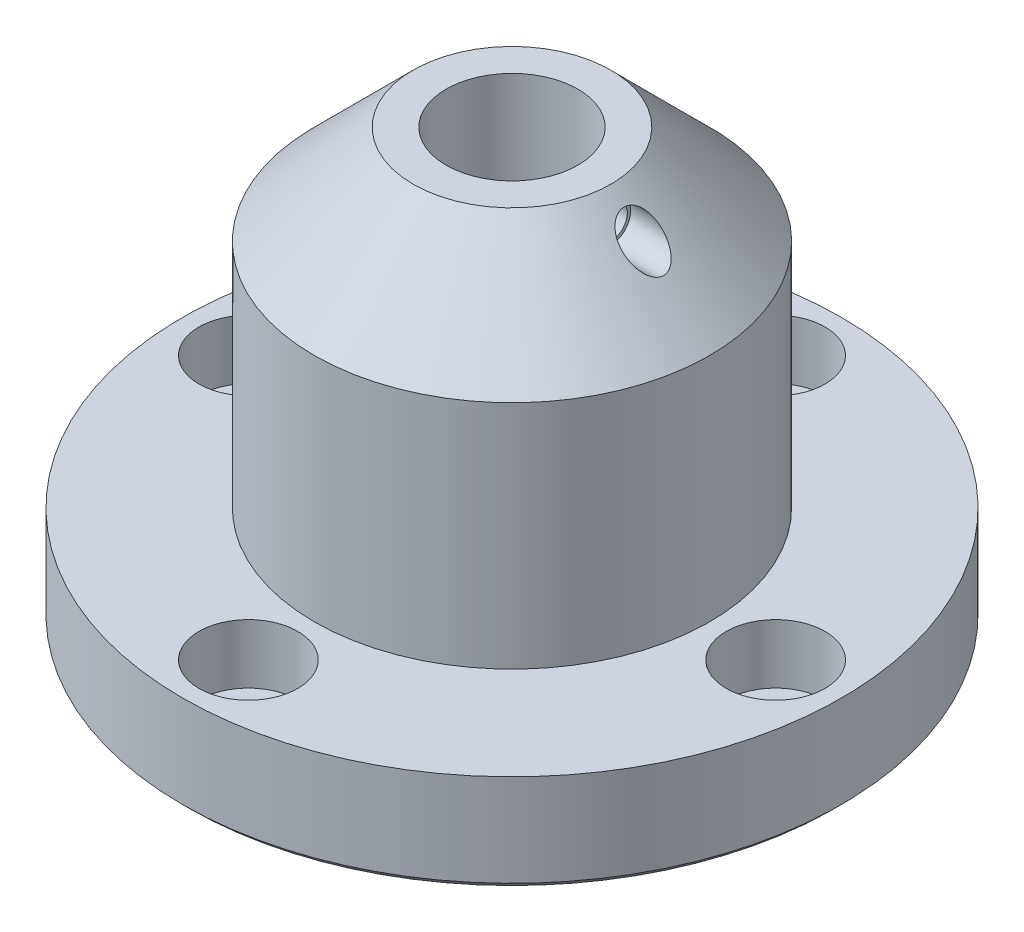
ISO-10303-21;
HEADER;
FILE_DESCRIPTION(('STEP AP214'),'2;1');
FILE_NAME('part.step','',(''),(''),'','','');
FILE_SCHEMA(('AUTOMOTIVE_DESIGN { 1 0 10303 214 1 1 1 1 }'));
ENDSEC;
DATA;
#1=APPLICATION_CONTEXT('core data for automotive mechanical design processes');
#2=APPLICATION_PROTOCOL_DEFINITION('international standard','automotive_design',2000,#1);
#3=PRODUCT_CONTEXT('',#1,'mechanical');
#4=PRODUCT('Part','Part','',(#3));
#5=PRODUCT_RELATED_PRODUCT_CATEGORY('part','',(#4));
#6=PRODUCT_DEFINITION_FORMATION('','',#4);
#7=PRODUCT_DEFINITION_CONTEXT('part definition',#1,'design');
#8=PRODUCT_DEFINITION('design','',#6,#7);
#9=PRODUCT_DEFINITION_SHAPE('','',#8);
#10=(LENGTH_UNIT() NAMED_UNIT(*) SI_UNIT(.MILLI.,.METRE.));
#11=(NAMED_UNIT(*) PLANE_ANGLE_UNIT() SI_UNIT($,.RADIAN.));
#12=(NAMED_UNIT(*) SI_UNIT($,.STERADIAN.) SOLID_ANGLE_UNIT());
#13=UNCERTAINTY_MEASURE_WITH_UNIT(LENGTH_MEASURE(1.E-05),#10,'distance_accuracy_value','');
#14=(GEOMETRIC_REPRESENTATION_CONTEXT(3) GLOBAL_UNCERTAINTY_ASSIGNED_CONTEXT((#13)) GLOBAL_UNIT_ASSIGNED_CONTEXT((#10,
#11,#12)) REPRESENTATION_CONTEXT('',''));
#15=CARTESIAN_POINT('',(0.,0.,0.));
#16=DIRECTION('',(0.,0.,1.));
#17=DIRECTION('',(1.,0.,0.));
#18=AXIS2_PLACEMENT_3D('',#15,#16,#17);
#19=CARTESIAN_POINT('',(0.,15.,0.));
#20=DIRECTION('',(0.,1.,0.));
#21=DIRECTION('',(0.,0.,1.));
#22=AXIS2_PLACEMENT_3D('',#19,#20,#21);
#23=PLANE('',#22);
#24=CARTESIAN_POINT('',(0.,15.,-40.));
#25=DIRECTION('',(0.,1.,0.));
#26=DIRECTION('',(0.,0.,1.));
#27=AXIS2_PLACEMENT_3D('',#24,#25,#26);
#28=CIRCLE('',#27,7.5);
#29=CARTESIAN_POINT('',(0.,15.,-32.5));
#30=VERTEX_POINT('',#29);
#31=EDGE_CURVE('E95',#30,#30,#28,.T.);
#32=ORIENTED_EDGE('',*,*,#31,.F.);
#33=EDGE_LOOP('',(#32));
#34=FACE_BOUND('',#33,.T.);
#35=CARTESIAN_POINT('',(0.,15.,40.));
#36=DIRECTION('',(0.,1.,0.));
#37=DIRECTION('',(0.,0.,1.));
#38=AXIS2_PLACEMENT_3D('',#35,#36,#37);
#39=CIRCLE('',#38,7.5);
#40=CARTESIAN_POINT('',(0.,15.,47.5));
#41=VERTEX_POINT('',#40);
#42=EDGE_CURVE('E83',#41,#41,#39,.T.);
#43=ORIENTED_EDGE('',*,*,#42,.F.);
#44=EDGE_LOOP('',(#43));
#45=FACE_BOUND('',#44,.T.);
#46=CARTESIAN_POINT('',(-40.,15.,0.));
#47=DIRECTION('',(0.,1.,0.));
#48=DIRECTION('',(0.,0.,1.));
#49=AXIS2_PLACEMENT_3D('',#46,#47,#48);
#50=CIRCLE('',#49,7.5);
#51=CARTESIAN_POINT('',(-40.,15.,7.5));
#52=VERTEX_POINT('',#51);
#53=EDGE_CURVE('E71',#52,#52,#50,.T.);
#54=ORIENTED_EDGE('',*,*,#53,.F.);
#55=EDGE_LOOP('',(#54));
#56=FACE_BOUND('',#55,.T.);
#57=CARTESIAN_POINT('',(40.,15.,0.));
#58=DIRECTION('',(0.,1.,0.));
#59=DIRECTION('',(0.,0.,1.));
#60=AXIS2_PLACEMENT_3D('',#57,#58,#59);
#61=CIRCLE('',#60,7.5);
#62=CARTESIAN_POINT('',(40.,15.,7.5));
#63=VERTEX_POINT('',#62);
#64=EDGE_CURVE('E59',#63,#63,#61,.T.);
#65=ORIENTED_EDGE('',*,*,#64,.F.);
#66=EDGE_LOOP('',(#65));
#67=FACE_BOUND('',#66,.T.);
#68=CARTESIAN_POINT('',(0.,15.,0.));
#69=DIRECTION('',(0.,1.,0.));
#70=DIRECTION('',(0.,0.,1.));
#71=AXIS2_PLACEMENT_3D('',#68,#69,#70);
#72=CIRCLE('',#71,50.);
#73=CARTESIAN_POINT('',(0.,15.,50.));
#74=VERTEX_POINT('',#73);
#75=EDGE_CURVE('E38',#74,#74,#72,.T.);
#76=ORIENTED_EDGE('',*,*,#75,.T.);
#77=EDGE_LOOP('',(#76));
#78=FACE_BOUND('',#77,.T.);
#79=CARTESIAN_POINT('',(0.,15.,0.));
#80=DIRECTION('',(0.,1.,0.));
#81=DIRECTION('',(0.,0.,1.));
#82=AXIS2_PLACEMENT_3D('',#79,#80,#81);
#83=CIRCLE('',#82,30.);
#84=CARTESIAN_POINT('',(0.,15.,30.));
#85=VERTEX_POINT('',#84);
#86=EDGE_CURVE('E41',#85,#85,#83,.T.);
#87=ORIENTED_EDGE('',*,*,#86,.F.);
#88=EDGE_LOOP('',(#87));
#89=FACE_BOUND('',#88,.T.);
#90=ADVANCED_FACE('F15',(#34,#45,#56,#67,#78,#89),#23,.T.);
#91=CARTESIAN_POINT('',(0.,15.,0.));
#92=DIRECTION('',(0.,-1.,0.));
#93=DIRECTION('',(0.,0.,-1.));
#94=AXIS2_PLACEMENT_3D('',#91,#92,#93);
#95=CYLINDRICAL_SURFACE('',#94,50.);
#96=CARTESIAN_POINT('',(0.,1.,0.));
#97=DIRECTION('',(0.,1.,0.));
#98=DIRECTION('',(0.,0.,1.));
#99=AXIS2_PLACEMENT_3D('',#96,#97,#98);
#100=CIRCLE('',#99,50.);
#101=CARTESIAN_POINT('',(0.,1.,50.));
#102=VERTEX_POINT('',#101);
#103=EDGE_CURVE('E26',#102,#102,#100,.T.);
#104=ORIENTED_EDGE('',*,*,#103,.T.);
#105=EDGE_LOOP('',(#104));
#106=FACE_BOUND('',#105,.T.);
#107=ORIENTED_EDGE('',*,*,#75,.F.);
#108=EDGE_LOOP('',(#107));
#109=FACE_BOUND('',#108,.T.);
#110=ADVANCED_FACE('F126',(#106,#109),#95,.T.);
#111=CARTESIAN_POINT('',(0.,0.,0.));
#112=DIRECTION('',(0.,1.,0.));
#113=DIRECTION('',(0.,0.,1.));
#114=AXIS2_PLACEMENT_3D('',#111,#112,#113);
#115=PLANE('',#114);
#116=CARTESIAN_POINT('',(0.,0.,-40.));
#117=DIRECTION('',(0.,1.,0.));
#118=DIRECTION('',(0.,0.,1.));
#119=AXIS2_PLACEMENT_3D('',#116,#117,#118);
#120=CIRCLE('',#119,4.5);
#121=CARTESIAN_POINT('',(0.,0.,-35.5));
#122=VERTEX_POINT('',#121);
#123=EDGE_CURVE('E86',#122,#122,#120,.T.);
#124=ORIENTED_EDGE('',*,*,#123,.T.);
#125=EDGE_LOOP('',(#124));
#126=FACE_BOUND('',#125,.T.);
#127=CARTESIAN_POINT('',(0.,0.,40.));
#128=DIRECTION('',(0.,1.,0.));
#129=DIRECTION('',(0.,0.,1.));
#130=AXIS2_PLACEMENT_3D('',#127,#128,#129);
#131=CIRCLE('',#130,4.5);
#132=CARTESIAN_POINT('',(0.,0.,44.5));
#133=VERTEX_POINT('',#132);
#134=EDGE_CURVE('E74',#133,#133,#131,.T.);
#135=ORIENTED_EDGE('',*,*,#134,.T.);
#136=EDGE_LOOP('',(#135));
#137=FACE_BOUND('',#136,.T.);
#138=CARTESIAN_POINT('',(-40.,0.,0.));
#139=DIRECTION('',(0.,1.,0.));
#140=DIRECTION('',(0.,0.,1.));
#141=AXIS2_PLACEMENT_3D('',#138,#139,#140);
#142=CIRCLE('',#141,4.5);
#143=CARTESIAN_POINT('',(-40.,0.,4.5));
#144=VERTEX_POINT('',#143);
#145=EDGE_CURVE('E62',#144,#144,#142,.T.);
#146=ORIENTED_EDGE('',*,*,#145,.T.);
#147=EDGE_LOOP('',(#146));
#148=FACE_BOUND('',#147,.T.);
#149=CARTESIAN_POINT('',(40.,0.,0.));
#150=DIRECTION('',(0.,1.,0.));
#151=DIRECTION('',(0.,0.,1.));
#152=AXIS2_PLACEMENT_3D('',#149,#150,#151);
#153=CIRCLE('',#152,4.5);
#154=CARTESIAN_POINT('',(40.,0.,4.5));
#155=VERTEX_POINT('',#154);
#156=EDGE_CURVE('E50',#155,#155,#153,.T.);
#157=ORIENTED_EDGE('',*,*,#156,.T.);
#158=EDGE_LOOP('',(#157));
#159=FACE_BOUND('',#158,.T.);
#160=CARTESIAN_POINT('',(0.,0.,0.));
#161=DIRECTION('',(0.,1.,0.));
#162=DIRECTION('',(0.,0.,1.));
#163=AXIS2_PLACEMENT_3D('',#160,#161,#162);
#164=CIRCLE('',#163,49.);
#165=CARTESIAN_POINT('',(0.,0.,49.));
#166=VERTEX_POINT('',#165);
#167=EDGE_CURVE('E10',#166,#166,#164,.F.);
#168=ORIENTED_EDGE('',*,*,#167,.T.);
#169=EDGE_LOOP('',(#168));
#170=FACE_BOUND('',#169,.T.);
#171=ADVANCED_FACE('F133',(#126,#137,#148,#159,#170),#115,.F.);
#172=CARTESIAN_POINT('',(0.,65.,0.));
#173=DIRECTION('',(0.,-1.,0.));
#174=DIRECTION('',(0.,0.,-1.));
#175=AXIS2_PLACEMENT_3D('',#172,#173,#174);
#176=CYLINDRICAL_SURFACE('',#175,30.);
#177=CARTESIAN_POINT('',(0.,50.,0.));
#178=DIRECTION('',(0.,1.,0.));
#179=DIRECTION('',(0.,0.,1.));
#180=AXIS2_PLACEMENT_3D('',#177,#178,#179);
#181=CIRCLE('',#180,30.);
#182=CARTESIAN_POINT('',(0.,50.,30.));
#183=VERTEX_POINT('',#182);
#184=EDGE_CURVE('E30',#183,#183,#181,.F.);
#185=ORIENTED_EDGE('',*,*,#184,.T.);
#186=EDGE_LOOP('',(#185));
#187=FACE_BOUND('',#186,.T.);
#188=ORIENTED_EDGE('',*,*,#86,.T.);
#189=EDGE_LOOP('',(#188));
#190=FACE_BOUND('',#189,.T.);
#191=ADVANCED_FACE('F140',(#187,#190),#176,.T.);
#192=CARTESIAN_POINT('',(0.,65.,0.));
#193=DIRECTION('',(0.,1.,0.));
#194=DIRECTION('',(0.,0.,1.));
#195=AXIS2_PLACEMENT_3D('',#192,#193,#194);
#196=PLANE('',#195);
#197=CARTESIAN_POINT('',(0.,65.,0.));
#198=DIRECTION('',(0.,1.,0.));
#199=DIRECTION('',(0.,0.,1.));
#200=AXIS2_PLACEMENT_3D('',#197,#198,#199);
#201=CIRCLE('',#200,10.);
#202=CARTESIAN_POINT('',(0.,65.,10.));
#203=VERTEX_POINT('',#202);
#204=EDGE_CURVE('E47',#203,#203,#201,.T.);
#205=ORIENTED_EDGE('',*,*,#204,.F.);
#206=EDGE_LOOP('',(#205));
#207=FACE_BOUND('',#206,.T.);
#208=CARTESIAN_POINT('',(0.,65.,0.));
#209=DIRECTION('',(0.,1.,0.));
#210=DIRECTION('',(0.,0.,1.));
#211=AXIS2_PLACEMENT_3D('',#208,#209,#210);
#212=CIRCLE('',#211,15.);
#213=CARTESIAN_POINT('',(0.,65.,15.));
#214=VERTEX_POINT('',#213);
#215=EDGE_CURVE('E35',#214,#214,#212,.T.);
#216=ORIENTED_EDGE('',*,*,#215,.T.);
#217=EDGE_LOOP('',(#216));
#218=FACE_BOUND('',#217,.T.);
#219=ADVANCED_FACE('F147',(#207,#218),#196,.T.);
#220=CARTESIAN_POINT('',(0.,65.,0.));
#221=DIRECTION('',(0.,-1.,0.));
#222=DIRECTION('',(0.,0.,-1.));
#223=AXIS2_PLACEMENT_3D('',#220,#221,#222);
#224=CONICAL_SURFACE('',#223,15.,0.785398163397446);
#225=CARTESIAN_POINT('',(17.9939348525649,61.8519422106139,-2.3601504292198));
#226=CARTESIAN_POINT('',(17.8878761683427,61.9690533107512,-2.26825713971177));
#227=CARTESIAN_POINT('',(17.7867158504891,62.0822587274053,-2.16535691571591));
#228=CARTESIAN_POINT('',(17.5976383132952,62.2964013879776,-1.93675663704572));
#229=CARTESIAN_POINT('',(17.5097220497686,62.3973377463455,-1.81105493824723));
#230=CARTESIAN_POINT('',(17.3651905091536,62.5650454536719,-1.56171788151438));
#231=CARTESIAN_POINT('',(17.3057893056143,62.6347019359473,-1.44165047812515));
#232=CARTESIAN_POINT('',(17.2010776049168,62.75838422248,-1.18791636965597));
#233=CARTESIAN_POINT('',(17.1557571154436,62.8124211092074,-1.05425939816262));
#234=CARTESIAN_POINT('',(17.0999259978453,62.8793214968705,-0.84553768808578));
#235=CARTESIAN_POINT('',(17.0832986750386,62.899313755443,-0.774288806010284));
#236=CARTESIAN_POINT('',(17.0544166831023,62.9341127373044,-0.629682477483591));
#237=CARTESIAN_POINT('',(17.0421599197678,62.9489219440505,-0.556326059140436));
#238=CARTESIAN_POINT('',(17.022209116535,62.9730590581683,-0.408112126713371));
#239=CARTESIAN_POINT('',(17.0145144309722,62.9823877411892,-0.333254826598286));
#240=CARTESIAN_POINT('',(17.0038014785718,62.9953831684878,-0.182744155017963));
#241=CARTESIAN_POINT('',(17.0007826783774,62.9990505585232,-0.107090875337728));
#242=CARTESIAN_POINT('',(16.99898944951,63.001225414215,0.102581297805744));
#243=CARTESIAN_POINT('',(17.0052569319251,62.9936049102131,0.236791965769901));
#244=CARTESIAN_POINT('',(17.0323260378878,62.9608076255296,0.50142977836553));
#245=CARTESIAN_POINT('',(17.0531255573378,62.9356333864593,0.631857467888427));
#246=CARTESIAN_POINT('',(17.1078438058817,62.86979320121,0.883736668839904));
#247=CARTESIAN_POINT('',(17.1415711685082,62.8293533532827,1.00528968026001));
#248=CARTESIAN_POINT('',(17.2207513039654,62.7351139982695,1.23897035488744));
#249=CARTESIAN_POINT('',(17.2662068412106,62.6813113415861,1.35109578767451));
#250=CARTESIAN_POINT('',(17.3725903056475,62.5564681059366,1.57564850239577));
#251=CARTESIAN_POINT('',(17.4346450224472,62.4842073789826,1.68685811921867));
#252=CARTESIAN_POINT('',(17.5689797166884,62.3293884230101,1.89494247575212));
#253=CARTESIAN_POINT('',(17.641266540422,62.2468233037452,1.99180752800624));
#254=CARTESIAN_POINT('',(17.8341056443181,62.0289219956948,2.21796939470777));
#255=CARTESIAN_POINT('',(17.9601456494076,61.8885490741076,2.33777657243716));
#256=CARTESIAN_POINT('',(18.2257988053316,61.5974783986356,2.54562522010961));
#257=CARTESIAN_POINT('',(18.3654431883072,61.446757133296,2.63359130103679));
#258=CARTESIAN_POINT('',(18.7030877426217,61.0878644994057,2.80506867923018));
#259=CARTESIAN_POINT('',(18.9047990433816,60.8775674103997,2.87691940980224));
#260=CARTESIAN_POINT('',(19.2138922625496,60.5611040596553,2.94904806891242));
#261=CARTESIAN_POINT('',(19.3181048843633,60.4553538897638,2.9671499040477));
#262=CARTESIAN_POINT('',(19.5281024868367,60.2440265977037,2.99194960301306));
#263=CARTESIAN_POINT('',(19.6338873116456,60.1384494595195,2.9986485896899));
#264=CARTESIAN_POINT('',(19.8484914695809,59.9259261516333,3.00100644758049));
#265=CARTESIAN_POINT('',(19.9573286452883,59.8189960776298,2.9964369781387));
#266=CARTESIAN_POINT('',(20.1752413172851,59.6064666031606,2.9759919137679));
#267=CARTESIAN_POINT('',(20.2843168176337,59.5008672255687,2.96011612475815));
#268=CARTESIAN_POINT('',(20.5020215024974,59.291523366892,2.91710086283059));
#269=CARTESIAN_POINT('',(20.6106507425944,59.1877786490598,2.88996283840158));
#270=CARTESIAN_POINT('',(20.8266838882845,58.9827378331905,2.82431664884581));
#271=CARTESIAN_POINT('',(20.9340879999991,58.8814413199487,2.78581042656331));
#272=CARTESIAN_POINT('',(21.2202271562986,58.6131117847345,2.66656624666892));
#273=CARTESIAN_POINT('',(21.3972393001838,58.4487611202001,2.5749938538306));
#274=CARTESIAN_POINT('',(21.6542528517851,58.2120440764431,2.4108920979253));
#275=CARTESIAN_POINT('',(21.738484307455,58.1347933784706,2.35175451568553));
#276=CARTESIAN_POINT('',(21.9032448588722,57.984246374572,2.22406754845533));
#277=CARTESIAN_POINT('',(21.9837754755941,57.9109484419465,2.15552207694887));
#278=CARTESIAN_POINT('',(22.1675915845805,57.7441989427653,1.98254092319693));
#279=CARTESIAN_POINT('',(22.2688849661985,57.6527572210591,1.87397362162721));
#280=CARTESIAN_POINT('',(22.4585648344404,57.4821591706562,1.63757328515587));
#281=CARTESIAN_POINT('',(22.5469711051634,57.4029839985414,1.50977040686102));
#282=CARTESIAN_POINT('',(22.6872036355616,57.2777471127601,1.26631169885177));
#283=CARTESIAN_POINT('',(22.7427691057298,57.2282556504408,1.15459395353832));
#284=CARTESIAN_POINT('',(22.8397945766337,57.1419754095044,0.920424550405331));
#285=CARTESIAN_POINT('',(22.881264233857,57.1051779344768,0.797980313500672));
#286=CARTESIAN_POINT('',(22.930579655067,57.061459951558,0.607704453013884));
#287=CARTESIAN_POINT('',(22.944912472336,57.0487628292213,0.542802598519208));
#288=CARTESIAN_POINT('',(22.9688011510879,57.0276080007283,0.411460188255798));
#289=CARTESIAN_POINT('',(22.978359561117,57.0191480328011,0.345020473247971));
#290=CARTESIAN_POINT('',(22.9924356770686,57.0066915879924,0.21122387779836));
#291=CARTESIAN_POINT('',(22.9969559283899,57.0026928571857,0.143867477915171));
#292=CARTESIAN_POINT('',(23.0008448515432,56.9992526329964,0.00891372142311917));
#293=CARTESIAN_POINT('',(23.0002142499817,56.9998104968364,-0.0586835998553941));
#294=CARTESIAN_POINT('',(22.9915428924812,57.0074815073787,-0.240723134312657));
#295=CARTESIAN_POINT('',(22.9786207393654,57.0189129038282,-0.354810022380121));
#296=CARTESIAN_POINT('',(22.9388677625787,57.0541151333588,-0.578465592105027));
#297=CARTESIAN_POINT('',(22.9120337456609,57.077888799413,-0.688033230204555));
#298=CARTESIAN_POINT('',(22.845672018285,57.1367700469657,-0.902511510872636));
#299=CARTESIAN_POINT('',(22.8059040547238,57.1720922175907,-1.00728742441529));
#300=CARTESIAN_POINT('',(22.7160800912271,57.2520300791458,-1.20847155591788));
#301=CARTESIAN_POINT('',(22.666019616684,57.2966498122497,-1.3048761084637));
#302=CARTESIAN_POINT('',(22.5247729934162,57.4228402832136,-1.54472049061743));
#303=CARTESIAN_POINT('',(22.4270708374696,57.5103979545235,-1.68118150582625));
#304=CARTESIAN_POINT('',(22.2172239808685,57.6993513414717,-1.93178109963223));
#305=CARTESIAN_POINT('',(22.1050374066328,57.8007872310502,-2.0458524421069));
#306=CARTESIAN_POINT('',(21.9032587912041,57.9842298686019,-2.22446318925486));
#307=CARTESIAN_POINT('',(21.8159096390378,58.0639343191618,-2.294006555877));
#308=CARTESIAN_POINT('',(21.6374119263365,58.2275107369023,-2.42262574205577));
#309=CARTESIAN_POINT('',(21.5462616619792,58.3113845762892,-2.48169680380126));
#310=CARTESIAN_POINT('',(21.3612054034591,58.4824661311968,-2.58985194523931));
#311=CARTESIAN_POINT('',(21.2672988432653,58.5696745326301,-2.63893395693409));
#312=CARTESIAN_POINT('',(21.0775577056932,58.7467755230897,-2.72749499506931));
#313=CARTESIAN_POINT('',(20.9817233683904,58.8366677785495,-2.76697520934986));
#314=CARTESIAN_POINT('',(20.7854661524371,59.0217635267126,-2.83781689536166));
#315=CARTESIAN_POINT('',(20.6849984267709,59.1170435266538,-2.8688545866587));
#316=CARTESIAN_POINT('',(20.4833070478436,59.3094846193938,-2.9211528680879));
#317=CARTESIAN_POINT('',(20.3820831202628,59.4066464174413,-2.94240971572255));
#318=CARTESIAN_POINT('',(20.0778244340514,59.7006163554161,-2.99164012304728));
#319=CARTESIAN_POINT('',(19.8743809536426,59.8997414034487,-3.00501021330457));
#320=CARTESIAN_POINT('',(19.5514442225713,60.2205977227931,-2.99431170619203));
#321=CARTESIAN_POINT('',(19.4306872625822,60.3416704150509,-2.98299902415162));
#322=CARTESIAN_POINT('',(19.1914350860273,60.5838920484541,-2.94518232650922));
#323=CARTESIAN_POINT('',(19.0729409154306,60.7050409993423,-2.91867145320338));
#324=CARTESIAN_POINT('',(18.8400211866826,60.9456716084857,-2.8497900526337));
#325=CARTESIAN_POINT('',(18.7255798308956,61.0651582947062,-2.80749083307487));
#326=CARTESIAN_POINT('',(18.501700055266,61.3014874038178,-2.70603691146112));
#327=CARTESIAN_POINT('',(18.3922555544885,61.4183329483632,-2.64690336671412));
#328=CARTESIAN_POINT('',(18.2358334671103,61.5872413947422,-2.54649956991908));
#329=CARTESIAN_POINT('',(18.1862538198999,61.6410793501617,-2.51217289205036));
#330=CARTESIAN_POINT('',(18.0887737026093,61.7475146020517,-2.43933506336267));
#331=CARTESIAN_POINT('',(18.0408745341117,61.8001109269584,-2.40082075977718));
#332=CARTESIAN_POINT('',(17.9939348525649,61.8519422106139,-2.3601504292198));
#333=B_SPLINE_CURVE_WITH_KNOTS('',3,(#225,#226,#227,#228,#229,#230,#231,#232,#233,#234,#235,
#236,#237,#238,#239,#240,#241,#242,#243,#244,#245,#246,#247,#248,#249,#250,#251,#252,#253,#254,
#255,#256,#257,#258,#259,#260,#261,#262,#263,#264,#265,#266,#267,#268,#269,#270,#271,#272,#273,
#274,#275,#276,#277,#278,#279,#280,#281,#282,#283,#284,#285,#286,#287,#288,#289,#290,#291,#292,
#293,#294,#295,#296,#297,#298,#299,#300,#301,#302,#303,#304,#305,#306,#307,#308,#309,#310,#311,
#312,#313,#314,#315,#316,#317,#318,#319,#320,#321,#322,#323,#324,#325,#326,#327,#328,#329,#330,
#331,#332),.UNSPECIFIED.,.T.,.F.,(4,2,2,2,2,2,2,2,2,2,2,2,2,2,2,2,2,2,2,2,2,2,2,2,2,2,2,2,2,2,2,
2,2,2,2,2,2,2,2,2,2,2,2,2,2,2,2,2,2,2,2,2,2,4),(0.,0.54810581632055,1.09625117010527,
1.54743180427724,1.99829152495253,2.22555010973466,2.45269965409524,2.67981704261328,
2.90690852298399,3.30844903457793,3.70993141905669,4.10568699569244,4.50153594009638,
4.93917280440138,5.37710388753493,6.04379326774964,6.71205097584955,7.60727768556541,
8.05567463710958,8.50402743212531,8.96153987821451,9.41906017800873,9.87652165220377,
10.3339049906712,11.1057255495804,11.4914209730012,11.8769564387819,12.3984698644411,
12.9191740427408,13.3204390697825,13.7214286492674,13.9241627435965,14.1267885038787,
14.3293118462853,14.5318066201716,14.8761496154402,15.2205716841782,15.5717966690266,
15.9231746709365,16.4878846234448,17.054265289596,17.4652936046323,17.876508183465,
18.2878078081943,18.699056525061,19.1243677358039,19.5498415506371,20.401541161127,
20.9151159342706,21.4289226244109,21.9404362586231,22.4513098414761,22.693707921163,
22.9362897772433),.UNSPECIFIED.);
#334=CARTESIAN_POINT('',(17.9939348525649,61.8519422106139,-2.3601504292198));
#335=VERTEX_POINT('',#334);
#336=EDGE_CURVE('E19',#335,#335,#333,.T.);
#337=ORIENTED_EDGE('',*,*,#336,.F.);
#338=EDGE_LOOP('',(#337));
#339=FACE_BOUND('',#338,.T.);
#340=ORIENTED_EDGE('',*,*,#184,.F.);
#341=EDGE_LOOP('',(#340));
#342=FACE_BOUND('',#341,.T.);
#343=ORIENTED_EDGE('',*,*,#215,.F.);
#344=EDGE_LOOP('',(#343));
#345=FACE_BOUND('',#344,.T.);
#346=ADVANCED_FACE('F144',(#339,#342,#345),#224,.T.);
#347=CARTESIAN_POINT('',(0.,1.,0.));
#348=DIRECTION('',(0.,1.,0.));
#349=DIRECTION('',(0.,0.,1.));
#350=AXIS2_PLACEMENT_3D('',#347,#348,#349);
#351=CONICAL_SURFACE('',#350,50.,0.785398163397445);
#352=ORIENTED_EDGE('',*,*,#167,.F.);
#353=EDGE_LOOP('',(#352));
#354=FACE_BOUND('',#353,.T.);
#355=ORIENTED_EDGE('',*,*,#103,.F.);
#356=EDGE_LOOP('',(#355));
#357=FACE_BOUND('',#356,.T.);
#358=ADVANCED_FACE('F17',(#354,#357),#351,.T.);
#359=CARTESIAN_POINT('',(0.,35.,0.));
#360=DIRECTION('',(0.,-1.,0.));
#361=DIRECTION('',(0.,0.,-1.));
#362=AXIS2_PLACEMENT_3D('',#359,#360,#361);
#363=PLANE('',#362);
#364=CARTESIAN_POINT('',(0.,35.,0.));
#365=DIRECTION('',(0.,1.,0.));
#366=DIRECTION('',(0.,0.,1.));
#367=AXIS2_PLACEMENT_3D('',#364,#365,#366);
#368=CIRCLE('',#367,10.);
#369=CARTESIAN_POINT('',(0.,35.,10.));
#370=VERTEX_POINT('',#369);
#371=EDGE_CURVE('E44',#370,#370,#368,.T.);
#372=ORIENTED_EDGE('',*,*,#371,.T.);
#373=EDGE_LOOP('',(#372));
#374=FACE_BOUND('',#373,.T.);
#375=ADVANCED_FACE('F154',(#374),#363,.F.);
#376=CARTESIAN_POINT('',(0.,65.,0.));
#377=DIRECTION('',(0.,1.,0.));
#378=DIRECTION('',(0.,0.,1.));
#379=AXIS2_PLACEMENT_3D('',#376,#377,#378);
#380=CYLINDRICAL_SURFACE('',#379,10.);
#381=CARTESIAN_POINT('',(9.68245836551854,60.,-2.5));
#382=CARTESIAN_POINT('',(9.6824610008786,60.1380507509266,-2.49999607859307));
#383=CARTESIAN_POINT('',(9.68544306014597,60.2761448986785,-2.48852624549766));
#384=CARTESIAN_POINT('',(9.69701861992564,60.5483675781735,-2.44302312546379));
#385=CARTESIAN_POINT('',(9.7056153862163,60.6824937544681,-2.4089767067421));
#386=CARTESIAN_POINT('',(9.7273872459615,60.9428035381871,-2.31949119963203));
#387=CARTESIAN_POINT('',(9.74055642690458,61.0689971553857,-2.26407972785449));
#388=CARTESIAN_POINT('',(9.76998192028759,61.3103108525399,-2.13352114126139));
#389=CARTESIAN_POINT('',(9.78623836378489,61.4254304620803,-2.05837318856069));
#390=CARTESIAN_POINT('',(9.82040716355625,61.6438616452622,-1.88870842731187));
#391=CARTESIAN_POINT('',(9.83834597623034,61.7468936003501,-1.79383688770404));
#392=CARTESIAN_POINT('',(9.87362875515294,61.9357613943603,-1.58818206410065));
#393=CARTESIAN_POINT('',(9.89097266566388,62.0215956256218,-1.4773972941803));
#394=CARTESIAN_POINT('',(9.92340415520582,62.1747754676313,-1.24114520107895));
#395=CARTESIAN_POINT('',(9.93845687400593,62.2418463881615,-1.11549457619511));
#396=CARTESIAN_POINT('',(9.96430811925984,62.3538096441531,-0.854263184292753));
#397=CARTESIAN_POINT('',(9.97510727334344,62.3987052519155,-0.718683885791934));
#398=CARTESIAN_POINT('',(9.9910475884818,62.4641478345786,-0.444358758754159));
#399=CARTESIAN_POINT('',(9.99629893844314,62.4851696443266,-0.305732719548974));
#400=CARTESIAN_POINT('',(10.000935941073,62.5037583792755,-0.0268288192627685));
#401=CARTESIAN_POINT('',(10.000322460967,62.5013287722096,0.113448794538069));
#402=CARTESIAN_POINT('',(9.99338094953534,62.4734251497499,0.388380617930967));
#403=CARTESIAN_POINT('',(9.98718002340871,62.4484636749461,0.523090539002664));
#404=CARTESIAN_POINT('',(9.96990836524857,62.3770287299515,0.786345618534212));
#405=CARTESIAN_POINT('',(9.95883737398451,62.3305541146226,0.914890448426092));
#406=CARTESIAN_POINT('',(9.93287509700883,62.216997429313,1.16351675875452));
#407=CARTESIAN_POINT('',(9.91795019695011,62.1497329553383,1.28351127441627));
#408=CARTESIAN_POINT('',(9.88589903809692,61.9966443208837,1.51068905585122));
#409=CARTESIAN_POINT('',(9.86877239652649,61.9108169314393,1.61787008771375));
#410=CARTESIAN_POINT('',(9.83363713769356,61.7202912580176,1.81943508771238));
#411=CARTESIAN_POINT('',(9.81561719525297,61.6151451076522,1.913394197688));
#412=CARTESIAN_POINT('',(9.78115043517327,61.3904000264597,2.08244093990756));
#413=CARTESIAN_POINT('',(9.76470369108288,61.2708004205089,2.15752769011507));
#414=CARTESIAN_POINT('',(9.73520496829318,61.0197099658511,2.28697032255646));
#415=CARTESIAN_POINT('',(9.72216983717007,60.8881642696872,2.34122391742612));
#416=CARTESIAN_POINT('',(9.70118640148669,60.6174145319232,2.42671405159095));
#417=CARTESIAN_POINT('',(9.69323700842733,60.4782121360154,2.45795551638265));
#418=CARTESIAN_POINT('',(9.68355356007457,60.2000404984701,2.49582963866591));
#419=CARTESIAN_POINT('',(9.68166088976933,60.061162206659,2.50309047391912));
#420=CARTESIAN_POINT('',(9.68387343364692,59.7841780634148,2.49451699051516));
#421=CARTESIAN_POINT('',(9.687978095703,59.6460721420506,2.47868479784979));
#422=CARTESIAN_POINT('',(9.70157081984979,59.3768857350515,2.42492546393825));
#423=CARTESIAN_POINT('',(9.71096970242531,59.2457272734308,2.38736406828191));
#424=CARTESIAN_POINT('',(9.73400718262805,58.9915685421467,2.29161808167047));
#425=CARTESIAN_POINT('',(9.74764628246407,58.8685692409442,2.2334310477125));
#426=CARTESIAN_POINT('',(9.77796137095511,58.6315587221331,2.0967706679366));
#427=CARTESIAN_POINT('',(9.79469168607245,58.517771159957,2.01792175383565));
#428=CARTESIAN_POINT('',(9.82917083071112,58.3048116371985,1.84265073233614));
#429=CARTESIAN_POINT('',(9.84691982728306,58.2056420833499,1.7462257370136));
#430=CARTESIAN_POINT('',(9.88197403031773,58.0221889574291,1.53565680246182));
#431=CARTESIAN_POINT('',(9.8992570206188,57.9383399374512,1.42112988132899));
#432=CARTESIAN_POINT('',(9.93097216613689,57.7910641330488,1.17925670673669));
#433=CARTESIAN_POINT('',(9.94540447003949,57.7276362833918,1.05191112239397));
#434=CARTESIAN_POINT('',(9.96970115738324,57.6235539654721,0.788895504327719));
#435=CARTESIAN_POINT('',(9.97959830022409,57.5827357156209,0.653293452569707));
#436=CARTESIAN_POINT('',(9.99385293395789,57.5245396653916,0.376874400797024));
#437=CARTESIAN_POINT('',(9.99821149393421,57.507157341261,0.236058412603105));
#438=CARTESIAN_POINT('',(10.0008542352201,57.4965810260612,-0.0427088161083087));
#439=CARTESIAN_POINT('',(9.99929947199971,57.5027457272615,-0.180634567415056));
#440=CARTESIAN_POINT('',(9.99064741143608,57.5376195682359,-0.453418741036876));
#441=CARTESIAN_POINT('',(9.98355027892921,57.5663280375329,-0.588277254452317));
#442=CARTESIAN_POINT('',(9.96463582134722,57.6451305494272,-0.85042758911193));
#443=CARTESIAN_POINT('',(9.95284411255981,57.695108633286,-0.977756236452155));
#444=CARTESIAN_POINT('',(9.92578222284145,57.8149264475489,-1.22229263260406));
#445=CARTESIAN_POINT('',(9.91051160346894,57.8847686816762,-1.33949910316408));
#446=CARTESIAN_POINT('',(9.87768124200718,58.0442880849903,-1.56350482105826));
#447=CARTESIAN_POINT('',(9.86007542354162,58.1344003572596,-1.66998747074583));
#448=CARTESIAN_POINT('',(9.82476622642974,58.3310571299434,-1.86653755068375));
#449=CARTESIAN_POINT('',(9.80706282418255,58.4376057902779,-1.95660081269146));
#450=CARTESIAN_POINT('',(9.77318689613755,58.6665035354737,-2.11940506617958));
#451=CARTESIAN_POINT('',(9.75704909183222,58.7891103084132,-2.19179154854096));
#452=CARTESIAN_POINT('',(9.7285988873707,59.0451387246871,-2.31481724146368));
#453=CARTESIAN_POINT('',(9.71628370583034,59.1785524152347,-2.36547227438037));
#454=CARTESIAN_POINT('',(9.69879771876843,59.4264425295879,-2.4360563214275));
#455=CARTESIAN_POINT('',(9.69271657508747,59.5397329109654,-2.4599829264922));
#456=CARTESIAN_POINT('',(9.6845459645655,59.7686721724942,-2.49195573142943));
#457=CARTESIAN_POINT('',(9.68245615722769,59.884320850611,-2.50000328592938));
#458=CARTESIAN_POINT('',(9.68245836551854,60.,-2.5));
#459=B_SPLINE_CURVE_WITH_KNOTS('',3,(#381,#382,#383,#384,#385,#386,#387,#388,#389,#390,#391,
#392,#393,#394,#395,#396,#397,#398,#399,#400,#401,#402,#403,#404,#405,#406,#407,#408,#409,#410,
#411,#412,#413,#414,#415,#416,#417,#418,#419,#420,#421,#422,#423,#424,#425,#426,#427,#428,#429,
#430,#431,#432,#433,#434,#435,#436,#437,#438,#439,#440,#441,#442,#443,#444,#445,#446,#447,#448,
#449,#450,#451,#452,#453,#454,#455,#456,#457,#458),.UNSPECIFIED.,.T.,.F.,(4,2,2,2,2,2,2,2,2,2,2,
2,2,2,2,2,2,2,2,2,2,2,2,2,2,2,2,2,2,2,2,2,2,2,2,2,2,2,4),(0.,0.413727441736114,
0.827695741428624,1.24113072716602,1.65458326755482,2.07623954192978,2.49793521479867,
2.92551496397921,3.35303159847093,3.77188750995347,4.19068148666021,4.60018262688947,
5.00970556724785,5.42292874254445,5.83622385468916,6.26070466571913,6.68520531199801,
7.11176432008401,7.53823200129544,7.953435747642,8.36860127188744,8.77697405014149,
9.1853952142636,9.60182845864099,10.0183301888999,10.4452533097026,10.872154157245,
11.2959207281187,11.7196054891398,12.131834461324,12.5440511738192,12.9540487656465,
13.3640980574301,13.7839709658701,14.2039503157045,14.6317647729113,15.0592672137502,
15.4059782718572,15.7526597510791),.UNSPECIFIED.);
#460=CARTESIAN_POINT('',(9.68245836551854,60.,-2.5));
#461=VERTEX_POINT('',#460);
#462=EDGE_CURVE('E101',#461,#461,#459,.T.);
#463=ORIENTED_EDGE('',*,*,#462,.T.);
#464=EDGE_LOOP('',(#463));
#465=FACE_BOUND('',#464,.T.);
#466=ORIENTED_EDGE('',*,*,#371,.F.);
#467=EDGE_LOOP('',(#466));
#468=FACE_BOUND('',#467,.T.);
#469=ORIENTED_EDGE('',*,*,#204,.T.);
#470=EDGE_LOOP('',(#469));
#471=FACE_BOUND('',#470,.T.);
#472=ADVANCED_FACE('F203',(#465,#468,#471),#380,.F.);
#473=CARTESIAN_POINT('',(40.,15.,0.));
#474=DIRECTION('',(0.,1.,0.));
#475=DIRECTION('',(0.,0.,1.));
#476=AXIS2_PLACEMENT_3D('',#473,#474,#475);
#477=CYLINDRICAL_SURFACE('',#476,4.5);
#478=ORIENTED_EDGE('',*,*,#156,.F.);
#479=EDGE_LOOP('',(#478));
#480=FACE_BOUND('',#479,.T.);
#481=CARTESIAN_POINT('',(40.,6.,0.));
#482=DIRECTION('',(0.,1.,0.));
#483=DIRECTION('',(0.,0.,1.));
#484=AXIS2_PLACEMENT_3D('',#481,#482,#483);
#485=CIRCLE('',#484,4.5);
#486=CARTESIAN_POINT('',(40.,6.,4.5));
#487=VERTEX_POINT('',#486);
#488=EDGE_CURVE('E53',#487,#487,#485,.T.);
#489=ORIENTED_EDGE('',*,*,#488,.T.);
#490=EDGE_LOOP('',(#489));
#491=FACE_BOUND('',#490,.T.);
#492=ADVANCED_FACE('F214',(#480,#491),#477,.F.);
#493=CARTESIAN_POINT('',(44.5,6.,0.));
#494=DIRECTION('',(0.,-1.,0.));
#495=DIRECTION('',(0.,0.,-1.));
#496=AXIS2_PLACEMENT_3D('',#493,#494,#495);
#497=PLANE('',#496);
#498=ORIENTED_EDGE('',*,*,#488,.F.);
#499=EDGE_LOOP('',(#498));
#500=FACE_BOUND('',#499,.T.);
#501=CARTESIAN_POINT('',(40.,6.,0.));
#502=DIRECTION('',(0.,1.,0.));
#503=DIRECTION('',(0.,0.,1.));
#504=AXIS2_PLACEMENT_3D('',#501,#502,#503);
#505=CIRCLE('',#504,7.5);
#506=CARTESIAN_POINT('',(40.,6.,7.5));
#507=VERTEX_POINT('',#506);
#508=EDGE_CURVE('E56',#507,#507,#505,.T.);
#509=ORIENTED_EDGE('',*,*,#508,.T.);
#510=EDGE_LOOP('',(#509));
#511=FACE_BOUND('',#510,.T.);
#512=ADVANCED_FACE('F224',(#500,#511),#497,.F.);
#513=CARTESIAN_POINT('',(40.,15.,0.));
#514=DIRECTION('',(0.,1.,0.));
#515=DIRECTION('',(0.,0.,1.));
#516=AXIS2_PLACEMENT_3D('',#513,#514,#515);
#517=CYLINDRICAL_SURFACE('',#516,7.5);
#518=ORIENTED_EDGE('',*,*,#508,.F.);
#519=EDGE_LOOP('',(#518));
#520=FACE_BOUND('',#519,.T.);
#521=ORIENTED_EDGE('',*,*,#64,.T.);
#522=EDGE_LOOP('',(#521));
#523=FACE_BOUND('',#522,.T.);
#524=ADVANCED_FACE('F234',(#520,#523),#517,.F.);
#525=CARTESIAN_POINT('',(-40.,15.,0.));
#526=DIRECTION('',(0.,1.,0.));
#527=DIRECTION('',(0.,0.,1.));
#528=AXIS2_PLACEMENT_3D('',#525,#526,#527);
#529=CYLINDRICAL_SURFACE('',#528,4.5);
#530=ORIENTED_EDGE('',*,*,#145,.F.);
#531=EDGE_LOOP('',(#530));
#532=FACE_BOUND('',#531,.T.);
#533=CARTESIAN_POINT('',(-40.,6.,0.));
#534=DIRECTION('',(0.,1.,0.));
#535=DIRECTION('',(0.,0.,1.));
#536=AXIS2_PLACEMENT_3D('',#533,#534,#535);
#537=CIRCLE('',#536,4.5);
#538=CARTESIAN_POINT('',(-40.,6.,4.5));
#539=VERTEX_POINT('',#538);
#540=EDGE_CURVE('E65',#539,#539,#537,.T.);
#541=ORIENTED_EDGE('',*,*,#540,.T.);
#542=EDGE_LOOP('',(#541));
#543=FACE_BOUND('',#542,.T.);
#544=ADVANCED_FACE('F244',(#532,#543),#529,.F.);
#545=CARTESIAN_POINT('',(-35.5,6.,0.));
#546=DIRECTION('',(0.,-1.,0.));
#547=DIRECTION('',(0.,0.,-1.));
#548=AXIS2_PLACEMENT_3D('',#545,#546,#547);
#549=PLANE('',#548);
#550=ORIENTED_EDGE('',*,*,#540,.F.);
#551=EDGE_LOOP('',(#550));
#552=FACE_BOUND('',#551,.T.);
#553=CARTESIAN_POINT('',(-40.,6.,0.));
#554=DIRECTION('',(0.,1.,0.));
#555=DIRECTION('',(0.,0.,1.));
#556=AXIS2_PLACEMENT_3D('',#553,#554,#555);
#557=CIRCLE('',#556,7.5);
#558=CARTESIAN_POINT('',(-40.,6.,7.5));
#559=VERTEX_POINT('',#558);
#560=EDGE_CURVE('E68',#559,#559,#557,.T.);
#561=ORIENTED_EDGE('',*,*,#560,.T.);
#562=EDGE_LOOP('',(#561));
#563=FACE_BOUND('',#562,.T.);
#564=ADVANCED_FACE('F254',(#552,#563),#549,.F.);
#565=CARTESIAN_POINT('',(-40.,15.,0.));
#566=DIRECTION('',(0.,1.,0.));
#567=DIRECTION('',(0.,0.,1.));
#568=AXIS2_PLACEMENT_3D('',#565,#566,#567);
#569=CYLINDRICAL_SURFACE('',#568,7.5);
#570=ORIENTED_EDGE('',*,*,#560,.F.);
#571=EDGE_LOOP('',(#570));
#572=FACE_BOUND('',#571,.T.);
#573=ORIENTED_EDGE('',*,*,#53,.T.);
#574=EDGE_LOOP('',(#573));
#575=FACE_BOUND('',#574,.T.);
#576=ADVANCED_FACE('F264',(#572,#575),#569,.F.);
#577=CARTESIAN_POINT('',(0.,15.,40.));
#578=DIRECTION('',(0.,1.,0.));
#579=DIRECTION('',(0.,0.,1.));
#580=AXIS2_PLACEMENT_3D('',#577,#578,#579);
#581=CYLINDRICAL_SURFACE('',#580,4.5);
#582=ORIENTED_EDGE('',*,*,#134,.F.);
#583=EDGE_LOOP('',(#582));
#584=FACE_BOUND('',#583,.T.);
#585=CARTESIAN_POINT('',(0.,6.,40.));
#586=DIRECTION('',(0.,1.,0.));
#587=DIRECTION('',(0.,0.,1.));
#588=AXIS2_PLACEMENT_3D('',#585,#586,#587);
#589=CIRCLE('',#588,4.5);
#590=CARTESIAN_POINT('',(0.,6.,44.5));
#591=VERTEX_POINT('',#590);
#592=EDGE_CURVE('E77',#591,#591,#589,.T.);
#593=ORIENTED_EDGE('',*,*,#592,.T.);
#594=EDGE_LOOP('',(#593));
#595=FACE_BOUND('',#594,.T.);
#596=ADVANCED_FACE('F274',(#584,#595),#581,.F.);
#597=CARTESIAN_POINT('',(4.5,6.,40.));
#598=DIRECTION('',(0.,-1.,0.));
#599=DIRECTION('',(0.,0.,-1.));
#600=AXIS2_PLACEMENT_3D('',#597,#598,#599);
#601=PLANE('',#600);
#602=ORIENTED_EDGE('',*,*,#592,.F.);
#603=EDGE_LOOP('',(#602));
#604=FACE_BOUND('',#603,.T.);
#605=CARTESIAN_POINT('',(0.,6.,40.));
#606=DIRECTION('',(0.,1.,0.));
#607=DIRECTION('',(0.,0.,1.));
#608=AXIS2_PLACEMENT_3D('',#605,#606,#607);
#609=CIRCLE('',#608,7.5);
#610=CARTESIAN_POINT('',(0.,6.,47.5));
#611=VERTEX_POINT('',#610);
#612=EDGE_CURVE('E80',#611,#611,#609,.T.);
#613=ORIENTED_EDGE('',*,*,#612,.T.);
#614=EDGE_LOOP('',(#613));
#615=FACE_BOUND('',#614,.T.);
#616=ADVANCED_FACE('F284',(#604,#615),#601,.F.);
#617=CARTESIAN_POINT('',(0.,15.,40.));
#618=DIRECTION('',(0.,1.,0.));
#619=DIRECTION('',(0.,0.,1.));
#620=AXIS2_PLACEMENT_3D('',#617,#618,#619);
#621=CYLINDRICAL_SURFACE('',#620,7.5);
#622=ORIENTED_EDGE('',*,*,#612,.F.);
#623=EDGE_LOOP('',(#622));
#624=FACE_BOUND('',#623,.T.);
#625=ORIENTED_EDGE('',*,*,#42,.T.);
#626=EDGE_LOOP('',(#625));
#627=FACE_BOUND('',#626,.T.);
#628=ADVANCED_FACE('F294',(#624,#627),#621,.F.);
#629=CARTESIAN_POINT('',(0.,15.,-40.));
#630=DIRECTION('',(0.,1.,0.));
#631=DIRECTION('',(0.,0.,1.));
#632=AXIS2_PLACEMENT_3D('',#629,#630,#631);
#633=CYLINDRICAL_SURFACE('',#632,4.5);
#634=ORIENTED_EDGE('',*,*,#123,.F.);
#635=EDGE_LOOP('',(#634));
#636=FACE_BOUND('',#635,.T.);
#637=CARTESIAN_POINT('',(0.,6.,-40.));
#638=DIRECTION('',(0.,1.,0.));
#639=DIRECTION('',(0.,0.,1.));
#640=AXIS2_PLACEMENT_3D('',#637,#638,#639);
#641=CIRCLE('',#640,4.5);
#642=CARTESIAN_POINT('',(0.,6.,-35.5));
#643=VERTEX_POINT('',#642);
#644=EDGE_CURVE('E89',#643,#643,#641,.T.);
#645=ORIENTED_EDGE('',*,*,#644,.T.);
#646=EDGE_LOOP('',(#645));
#647=FACE_BOUND('',#646,.T.);
#648=ADVANCED_FACE('F304',(#636,#647),#633,.F.);
#649=CARTESIAN_POINT('',(4.5,6.,-40.));
#650=DIRECTION('',(0.,-1.,0.));
#651=DIRECTION('',(0.,0.,-1.));
#652=AXIS2_PLACEMENT_3D('',#649,#650,#651);
#653=PLANE('',#652);
#654=ORIENTED_EDGE('',*,*,#644,.F.);
#655=EDGE_LOOP('',(#654));
#656=FACE_BOUND('',#655,.T.);
#657=CARTESIAN_POINT('',(0.,6.,-40.));
#658=DIRECTION('',(0.,1.,0.));
#659=DIRECTION('',(0.,0.,1.));
#660=AXIS2_PLACEMENT_3D('',#657,#658,#659);
#661=CIRCLE('',#660,7.5);
#662=CARTESIAN_POINT('',(0.,6.,-32.5));
#663=VERTEX_POINT('',#662);
#664=EDGE_CURVE('E92',#663,#663,#661,.T.);
#665=ORIENTED_EDGE('',*,*,#664,.T.);
#666=EDGE_LOOP('',(#665));
#667=FACE_BOUND('',#666,.T.);
#668=ADVANCED_FACE('F314',(#656,#667),#653,.F.);
#669=CARTESIAN_POINT('',(0.,15.,-40.));
#670=DIRECTION('',(0.,1.,0.));
#671=DIRECTION('',(0.,0.,1.));
#672=AXIS2_PLACEMENT_3D('',#669,#670,#671);
#673=CYLINDRICAL_SURFACE('',#672,7.5);
#674=ORIENTED_EDGE('',*,*,#664,.F.);
#675=EDGE_LOOP('',(#674));
#676=FACE_BOUND('',#675,.T.);
#677=ORIENTED_EDGE('',*,*,#31,.T.);
#678=EDGE_LOOP('',(#677));
#679=FACE_BOUND('',#678,.T.);
#680=ADVANCED_FACE('F324',(#676,#679),#673,.F.);
#681=CARTESIAN_POINT('',(15.,60.,0.));
#682=DIRECTION('',(1.,0.,0.));
#683=DIRECTION('',(0.,0.,-1.));
#684=AXIS2_PLACEMENT_3D('',#681,#682,#683);
#685=CYLINDRICAL_SURFACE('',#684,3.);
#686=ORIENTED_EDGE('',*,*,#336,.T.);
#687=EDGE_LOOP('',(#686));
#688=FACE_BOUND('',#687,.T.);
#689=CARTESIAN_POINT('',(15.,60.,0.));
#690=DIRECTION('',(1.,0.,0.));
#691=DIRECTION('',(0.,0.,-1.));
#692=AXIS2_PLACEMENT_3D('',#689,#690,#691);
#693=CIRCLE('',#692,3.);
#694=CARTESIAN_POINT('',(15.,60.,-3.));
#695=VERTEX_POINT('',#694);
#696=EDGE_CURVE('E98',#695,#695,#693,.T.);
#697=ORIENTED_EDGE('',*,*,#696,.F.);
#698=EDGE_LOOP('',(#697));
#699=FACE_BOUND('',#698,.T.);
#700=ADVANCED_FACE('F121',(#688,#699),#685,.F.);
#701=CARTESIAN_POINT('',(15.,60.,0.));
#702=DIRECTION('',(1.,0.,0.));
#703=DIRECTION('',(0.,0.,-1.));
#704=AXIS2_PLACEMENT_3D('',#701,#702,#703);
#705=PLANE('',#704);
#706=CARTESIAN_POINT('',(15.,60.,0.));
#707=DIRECTION('',(1.,0.,0.));
#708=DIRECTION('',(0.,0.,-1.));
#709=AXIS2_PLACEMENT_3D('',#706,#707,#708);
#710=CIRCLE('',#709,2.5);
#711=CARTESIAN_POINT('',(15.,60.,-2.5));
#712=VERTEX_POINT('',#711);
#713=EDGE_CURVE('E108',#712,#712,#710,.T.);
#714=ORIENTED_EDGE('',*,*,#713,.F.);
#715=EDGE_LOOP('',(#714));
#716=FACE_BOUND('',#715,.T.);
#717=ORIENTED_EDGE('',*,*,#696,.T.);
#718=EDGE_LOOP('',(#717));
#719=FACE_BOUND('',#718,.T.);
#720=ADVANCED_FACE('F114',(#716,#719),#705,.T.);
#721=CARTESIAN_POINT('',(15.,60.,0.));
#722=DIRECTION('',(1.,0.,0.));
#723=DIRECTION('',(0.,0.,-1.));
#724=AXIS2_PLACEMENT_3D('',#721,#722,#723);
#725=CYLINDRICAL_SURFACE('',#724,2.5);
#726=ORIENTED_EDGE('',*,*,#462,.F.);
#727=EDGE_LOOP('',(#726));
#728=FACE_BOUND('',#727,.T.);
#729=ORIENTED_EDGE('',*,*,#713,.T.);
#730=EDGE_LOOP('',(#729));
#731=FACE_BOUND('',#730,.T.);
#732=ADVANCED_FACE('F111',(#728,#731),#725,.F.);
#733=CLOSED_SHELL('',(#90,#110,#171,#191,#219,#346,#358,#375,#472,#492,#512,#524,#544,#564,#576,
#596,#616,#628,#648,#668,#680,#700,#720,#732));
#734=MANIFOLD_SOLID_BREP('B1',#733);
#735=ADVANCED_BREP_SHAPE_REPRESENTATION('',(#18,#734),#14);
#736=SHAPE_DEFINITION_REPRESENTATION(#9,#735);
ENDSEC;
END-ISO-10303-21;
